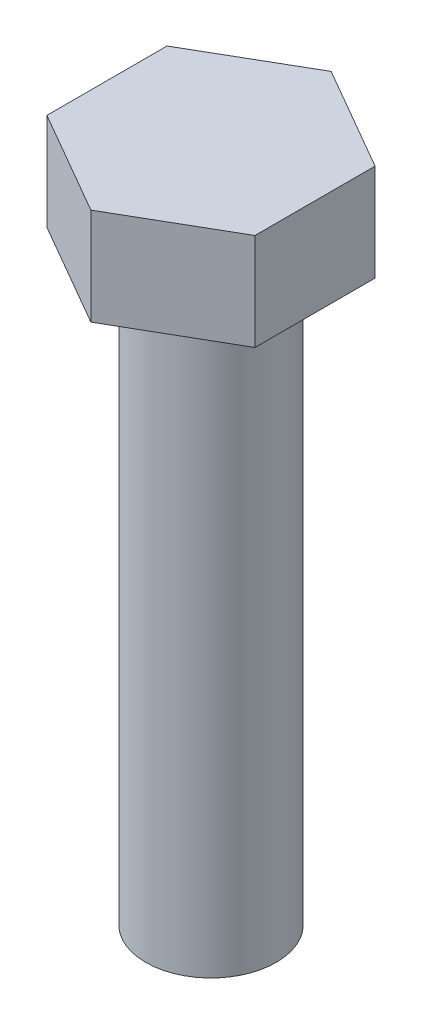
ISO-10303-21;
HEADER;
FILE_DESCRIPTION(('STEP AP214'),'2;1');
FILE_NAME('part.step','',(''),(''),'','','');
FILE_SCHEMA(('AUTOMOTIVE_DESIGN { 1 0 10303 214 1 1 1 1 }'));
ENDSEC;
DATA;
#1=APPLICATION_CONTEXT('core data for automotive mechanical design processes');
#2=APPLICATION_PROTOCOL_DEFINITION('international standard','automotive_design',2000,#1);
#3=PRODUCT_CONTEXT('',#1,'mechanical');
#4=PRODUCT('Part','Part','',(#3));
#5=PRODUCT_RELATED_PRODUCT_CATEGORY('part','',(#4));
#6=PRODUCT_DEFINITION_FORMATION('','',#4);
#7=PRODUCT_DEFINITION_CONTEXT('part definition',#1,'design');
#8=PRODUCT_DEFINITION('design','',#6,#7);
#9=PRODUCT_DEFINITION_SHAPE('','',#8);
#10=(LENGTH_UNIT() NAMED_UNIT(*) SI_UNIT(.MILLI.,.METRE.));
#11=(NAMED_UNIT(*) PLANE_ANGLE_UNIT() SI_UNIT($,.RADIAN.));
#12=(NAMED_UNIT(*) SI_UNIT($,.STERADIAN.) SOLID_ANGLE_UNIT());
#13=UNCERTAINTY_MEASURE_WITH_UNIT(LENGTH_MEASURE(1.E-05),#10,'distance_accuracy_value','');
#14=(GEOMETRIC_REPRESENTATION_CONTEXT(3) GLOBAL_UNCERTAINTY_ASSIGNED_CONTEXT((#13)) GLOBAL_UNIT_ASSIGNED_CONTEXT((#10,
#11,#12)) REPRESENTATION_CONTEXT('',''));
#15=CARTESIAN_POINT('',(0.,0.,0.));
#16=DIRECTION('',(0.,0.,1.));
#17=DIRECTION('',(1.,0.,0.));
#18=AXIS2_PLACEMENT_3D('',#15,#16,#17);
#19=CARTESIAN_POINT('',(5.44829999999996,5.08,-3.1455774716259));
#20=DIRECTION('',(-0.499999999999995,0.,0.866025403784442));
#21=DIRECTION('',(0.866025403784442,0.,0.499999999999995));
#22=AXIS2_PLACEMENT_3D('',#19,#20,#21);
#23=PLANE('',#22);
#24=DIRECTION('',(-0.866025403784441,0.,-0.499999999999995));
#25=VECTOR('',#24,1.);
#26=CARTESIAN_POINT('',(5.44829999999996,0.,-3.1455774716259));
#27=LINE('',#26,#25);
#28=CARTESIAN_POINT('',(5.44829999999996,0.,-3.1455774716259));
#29=VERTEX_POINT('',#28);
#30=CARTESIAN_POINT('',(0.,0.,-6.29115494325167));
#31=VERTEX_POINT('',#30);
#32=EDGE_CURVE('E136',#29,#31,#27,.T.);
#33=ORIENTED_EDGE('',*,*,#32,.T.);
#34=DIRECTION('',(0.,-1.,0.));
#35=VECTOR('',#34,1.);
#36=CARTESIAN_POINT('',(0.,5.08,-6.29115494325167));
#37=LINE('',#36,#35);
#38=CARTESIAN_POINT('',(0.,5.08,-6.29115494325167));
#39=VERTEX_POINT('',#38);
#40=EDGE_CURVE('E48',#39,#31,#37,.T.);
#41=ORIENTED_EDGE('',*,*,#40,.F.);
#42=DIRECTION('',(-0.866025403784441,0.,-0.499999999999995));
#43=VECTOR('',#42,1.);
#44=CARTESIAN_POINT('',(5.44829999999996,5.08,-3.1455774716259));
#45=LINE('',#44,#43);
#46=CARTESIAN_POINT('',(5.44829999999996,5.08,-3.1455774716259));
#47=VERTEX_POINT('',#46);
#48=EDGE_CURVE('E153',#47,#39,#45,.T.);
#49=ORIENTED_EDGE('',*,*,#48,.F.);
#50=DIRECTION('',(0.,-1.,0.));
#51=VECTOR('',#50,1.);
#52=CARTESIAN_POINT('',(5.44829999999996,5.08,-3.1455774716259));
#53=LINE('',#52,#51);
#54=EDGE_CURVE('E135',#47,#29,#53,.T.);
#55=ORIENTED_EDGE('',*,*,#54,.T.);
#56=EDGE_LOOP('',(#33,#41,#49,#55));
#57=FACE_BOUND('',#56,.T.);
#58=ADVANCED_FACE('F44',(#57),#23,.F.);
#59=CARTESIAN_POINT('',(0.,5.08,-6.29115494325167));
#60=DIRECTION('',(0.500000000000001,0.,0.866025403784438));
#61=DIRECTION('',(0.866025403784438,0.,-0.500000000000001));
#62=AXIS2_PLACEMENT_3D('',#59,#60,#61);
#63=PLANE('',#62);
#64=DIRECTION('',(-0.866025403784438,0.,0.500000000000001));
#65=VECTOR('',#64,1.);
#66=CARTESIAN_POINT('',(0.,0.,-6.29115494325167));
#67=LINE('',#66,#65);
#68=CARTESIAN_POINT('',(-5.4483,0.,-3.14557747162582));
#69=VERTEX_POINT('',#68);
#70=EDGE_CURVE('E139',#31,#69,#67,.T.);
#71=ORIENTED_EDGE('',*,*,#70,.T.);
#72=DIRECTION('',(0.,-1.,0.));
#73=VECTOR('',#72,1.);
#74=CARTESIAN_POINT('',(-5.4483,5.08,-3.14557747162582));
#75=LINE('',#74,#73);
#76=CARTESIAN_POINT('',(-5.4483,5.08,-3.14557747162582));
#77=VERTEX_POINT('',#76);
#78=EDGE_CURVE('E159',#77,#69,#75,.T.);
#79=ORIENTED_EDGE('',*,*,#78,.F.);
#80=DIRECTION('',(-0.866025403784438,0.,0.500000000000001));
#81=VECTOR('',#80,1.);
#82=CARTESIAN_POINT('',(0.,5.08,-6.29115494325167));
#83=LINE('',#82,#81);
#84=EDGE_CURVE('E102',#39,#77,#83,.T.);
#85=ORIENTED_EDGE('',*,*,#84,.F.);
#86=ORIENTED_EDGE('',*,*,#40,.T.);
#87=EDGE_LOOP('',(#71,#79,#85,#86));
#88=FACE_BOUND('',#87,.T.);
#89=ADVANCED_FACE('F168',(#88),#63,.F.);
#90=CARTESIAN_POINT('',(-5.4483,5.08,-3.14557747162582));
#91=DIRECTION('',(1.,0.,0.));
#92=DIRECTION('',(0.,0.,-1.));
#93=AXIS2_PLACEMENT_3D('',#90,#91,#92);
#94=PLANE('',#93);
#95=DIRECTION('',(0.,0.,1.));
#96=VECTOR('',#95,1.);
#97=CARTESIAN_POINT('',(-5.4483,0.,-3.14557747162582));
#98=LINE('',#97,#96);
#99=CARTESIAN_POINT('',(-5.44829999999998,0.,3.14557747162586));
#100=VERTEX_POINT('',#99);
#101=EDGE_CURVE('E143',#69,#100,#98,.T.);
#102=ORIENTED_EDGE('',*,*,#101,.T.);
#103=DIRECTION('',(0.,-1.,0.));
#104=VECTOR('',#103,1.);
#105=CARTESIAN_POINT('',(-5.44829999999998,5.08,3.14557747162586));
#106=LINE('',#105,#104);
#107=CARTESIAN_POINT('',(-5.44829999999998,5.08,3.14557747162586));
#108=VERTEX_POINT('',#107);
#109=EDGE_CURVE('E124',#108,#100,#106,.T.);
#110=ORIENTED_EDGE('',*,*,#109,.F.);
#111=DIRECTION('',(0.,0.,1.));
#112=VECTOR('',#111,1.);
#113=CARTESIAN_POINT('',(-5.4483,5.08,-3.14557747162582));
#114=LINE('',#113,#112);
#115=EDGE_CURVE('E114',#77,#108,#114,.T.);
#116=ORIENTED_EDGE('',*,*,#115,.F.);
#117=ORIENTED_EDGE('',*,*,#78,.T.);
#118=EDGE_LOOP('',(#102,#110,#116,#117));
#119=FACE_BOUND('',#118,.T.);
#120=ADVANCED_FACE('F175',(#119),#94,.F.);
#121=CARTESIAN_POINT('',(-5.44829999999998,5.08,3.14557747162586));
#122=DIRECTION('',(0.499999999999995,0.,-0.866025403784441));
#123=DIRECTION('',(-0.866025403784442,0.,-0.499999999999995));
#124=AXIS2_PLACEMENT_3D('',#121,#122,#123);
#125=PLANE('',#124);
#126=DIRECTION('',(0.866025403784442,0.,0.499999999999995));
#127=VECTOR('',#126,1.);
#128=CARTESIAN_POINT('',(-5.44829999999998,0.,3.14557747162586));
#129=LINE('',#128,#127);
#130=CARTESIAN_POINT('',(0.,0.,6.29115494325167));
#131=VERTEX_POINT('',#130);
#132=EDGE_CURVE('E121',#100,#131,#129,.T.);
#133=ORIENTED_EDGE('',*,*,#132,.T.);
#134=DIRECTION('',(0.,-1.,0.));
#135=VECTOR('',#134,1.);
#136=CARTESIAN_POINT('',(0.,5.08,6.29115494325167));
#137=LINE('',#136,#135);
#138=CARTESIAN_POINT('',(0.,5.08,6.29115494325167));
#139=VERTEX_POINT('',#138);
#140=EDGE_CURVE('E116',#139,#131,#137,.T.);
#141=ORIENTED_EDGE('',*,*,#140,.F.);
#142=DIRECTION('',(0.866025403784442,0.,0.499999999999995));
#143=VECTOR('',#142,1.);
#144=CARTESIAN_POINT('',(-5.44829999999998,5.08,3.14557747162586));
#145=LINE('',#144,#143);
#146=EDGE_CURVE('E108',#108,#139,#145,.T.);
#147=ORIENTED_EDGE('',*,*,#146,.F.);
#148=ORIENTED_EDGE('',*,*,#109,.T.);
#149=EDGE_LOOP('',(#133,#141,#147,#148));
#150=FACE_BOUND('',#149,.T.);
#151=ADVANCED_FACE('F123',(#150),#125,.F.);
#152=CARTESIAN_POINT('',(0.,5.08,6.29115494325167));
#153=DIRECTION('',(-0.500000000000007,0.,-0.866025403784435));
#154=DIRECTION('',(-0.866025403784435,0.,0.500000000000007));
#155=AXIS2_PLACEMENT_3D('',#152,#153,#154);
#156=PLANE('',#155);
#157=DIRECTION('',(0.866025403784435,0.,-0.500000000000007));
#158=VECTOR('',#157,1.);
#159=CARTESIAN_POINT('',(0.,0.,6.29115494325167));
#160=LINE('',#159,#158);
#161=CARTESIAN_POINT('',(5.44830000000002,0.,3.14557747162578));
#162=VERTEX_POINT('',#161);
#163=EDGE_CURVE('E86',#131,#162,#160,.T.);
#164=ORIENTED_EDGE('',*,*,#163,.T.);
#165=DIRECTION('',(0.,-1.,0.));
#166=VECTOR('',#165,1.);
#167=CARTESIAN_POINT('',(5.44830000000002,5.08,3.14557747162578));
#168=LINE('',#167,#166);
#169=CARTESIAN_POINT('',(5.44830000000002,5.08,3.14557747162578));
#170=VERTEX_POINT('',#169);
#171=EDGE_CURVE('E128',#170,#162,#168,.T.);
#172=ORIENTED_EDGE('',*,*,#171,.F.);
#173=DIRECTION('',(0.866025403784435,0.,-0.500000000000007));
#174=VECTOR('',#173,1.);
#175=CARTESIAN_POINT('',(0.,5.08,6.29115494325167));
#176=LINE('',#175,#174);
#177=EDGE_CURVE('E115',#139,#170,#176,.T.);
#178=ORIENTED_EDGE('',*,*,#177,.F.);
#179=ORIENTED_EDGE('',*,*,#140,.T.);
#180=EDGE_LOOP('',(#164,#172,#178,#179));
#181=FACE_BOUND('',#180,.T.);
#182=ADVANCED_FACE('F126',(#181),#156,.F.);
#183=CARTESIAN_POINT('',(5.44830000000002,5.08,3.14557747162578));
#184=DIRECTION('',(-1.,0.,0.));
#185=DIRECTION('',(0.,0.,1.));
#186=AXIS2_PLACEMENT_3D('',#183,#184,#185);
#187=PLANE('',#186);
#188=DIRECTION('',(0.,0.,-1.));
#189=VECTOR('',#188,1.);
#190=CARTESIAN_POINT('',(5.44830000000002,0.,3.14557747162578));
#191=LINE('',#190,#189);
#192=EDGE_CURVE('E95',#162,#29,#191,.T.);
#193=ORIENTED_EDGE('',*,*,#192,.T.);
#194=ORIENTED_EDGE('',*,*,#54,.F.);
#195=DIRECTION('',(0.,0.,-1.));
#196=VECTOR('',#195,1.);
#197=CARTESIAN_POINT('',(5.44830000000002,5.08,3.14557747162578));
#198=LINE('',#197,#196);
#199=EDGE_CURVE('E63',#170,#47,#198,.T.);
#200=ORIENTED_EDGE('',*,*,#199,.F.);
#201=ORIENTED_EDGE('',*,*,#171,.T.);
#202=EDGE_LOOP('',(#193,#194,#200,#201));
#203=FACE_BOUND('',#202,.T.);
#204=ADVANCED_FACE('F197',(#203),#187,.F.);
#205=CARTESIAN_POINT('',(0.,5.08,0.));
#206=DIRECTION('',(0.,1.,0.));
#207=DIRECTION('',(0.,0.,1.));
#208=AXIS2_PLACEMENT_3D('',#205,#206,#207);
#209=PLANE('',#208);
#210=ORIENTED_EDGE('',*,*,#48,.T.);
#211=ORIENTED_EDGE('',*,*,#84,.T.);
#212=ORIENTED_EDGE('',*,*,#115,.T.);
#213=ORIENTED_EDGE('',*,*,#146,.T.);
#214=ORIENTED_EDGE('',*,*,#177,.T.);
#215=ORIENTED_EDGE('',*,*,#199,.T.);
#216=EDGE_LOOP('',(#210,#211,#212,#213,#214,#215));
#217=FACE_BOUND('',#216,.T.);
#218=ADVANCED_FACE('F106',(#217),#209,.T.);
#219=CARTESIAN_POINT('',(0.,0.,0.));
#220=DIRECTION('',(0.,1.,0.));
#221=DIRECTION('',(0.,0.,1.));
#222=AXIS2_PLACEMENT_3D('',#219,#220,#221);
#223=PLANE('',#222);
#224=CARTESIAN_POINT('',(0.,0.,0.));
#225=DIRECTION('',(0.,-1.,0.));
#226=DIRECTION('',(0.,0.,-1.));
#227=AXIS2_PLACEMENT_3D('',#224,#225,#226);
#228=CIRCLE('',#227,3.4163);
#229=CARTESIAN_POINT('',(0.,0.,3.4163));
#230=VERTEX_POINT('',#229);
#231=EDGE_CURVE('E11',#230,#230,#228,.T.);
#232=ORIENTED_EDGE('',*,*,#231,.F.);
#233=EDGE_LOOP('',(#232));
#234=FACE_BOUND('',#233,.T.);
#235=ORIENTED_EDGE('',*,*,#32,.F.);
#236=ORIENTED_EDGE('',*,*,#192,.F.);
#237=ORIENTED_EDGE('',*,*,#163,.F.);
#238=ORIENTED_EDGE('',*,*,#132,.F.);
#239=ORIENTED_EDGE('',*,*,#101,.F.);
#240=ORIENTED_EDGE('',*,*,#70,.F.);
#241=EDGE_LOOP('',(#235,#236,#237,#238,#239,#240));
#242=FACE_BOUND('',#241,.T.);
#243=ADVANCED_FACE('F173',(#234,#242),#223,.F.);
#244=CARTESIAN_POINT('',(0.,-30.48,0.));
#245=DIRECTION('',(0.,1.,0.));
#246=DIRECTION('',(0.,0.,1.));
#247=AXIS2_PLACEMENT_3D('',#244,#245,#246);
#248=CYLINDRICAL_SURFACE('',#247,3.4163);
#249=CARTESIAN_POINT('',(0.,-30.48,0.));
#250=DIRECTION('',(0.,-1.,0.));
#251=DIRECTION('',(0.,0.,-1.));
#252=AXIS2_PLACEMENT_3D('',#249,#250,#251);
#253=CIRCLE('',#252,3.4163);
#254=CARTESIAN_POINT('',(0.,-30.48,3.4163));
#255=VERTEX_POINT('',#254);
#256=EDGE_CURVE('E141',#255,#255,#253,.T.);
#257=CARTESIAN_POINT('',(0.,-30.48,3.4163));
#258=CARTESIAN_POINT('',(0.,-30.1625,3.4163));
#259=CARTESIAN_POINT('',(0.,-29.845,3.4163));
#260=CARTESIAN_POINT('',(0.,-29.21,3.4163));
#261=CARTESIAN_POINT('',(0.,-28.8925,3.4163));
#262=CARTESIAN_POINT('',(0.,-28.2575,3.4163));
#263=CARTESIAN_POINT('',(0.,-27.94,3.4163));
#264=CARTESIAN_POINT('',(0.,-27.305,3.4163));
#265=CARTESIAN_POINT('',(0.,-26.9875,3.4163));
#266=CARTESIAN_POINT('',(0.,-26.3525,3.4163));
#267=CARTESIAN_POINT('',(0.,-26.035,3.4163));
#268=CARTESIAN_POINT('',(0.,-25.4,3.4163));
#269=CARTESIAN_POINT('',(0.,-25.0825,3.4163));
#270=CARTESIAN_POINT('',(0.,-24.4475,3.4163));
#271=CARTESIAN_POINT('',(0.,-24.13,3.4163));
#272=CARTESIAN_POINT('',(0.,-23.495,3.4163));
#273=CARTESIAN_POINT('',(0.,-23.1775,3.4163));
#274=CARTESIAN_POINT('',(0.,-22.5425,3.4163));
#275=CARTESIAN_POINT('',(0.,-22.225,3.4163));
#276=CARTESIAN_POINT('',(0.,-21.59,3.4163));
#277=CARTESIAN_POINT('',(0.,-21.2725,3.4163));
#278=CARTESIAN_POINT('',(0.,-20.6375,3.4163));
#279=CARTESIAN_POINT('',(0.,-20.32,3.4163));
#280=CARTESIAN_POINT('',(0.,-19.685,3.4163));
#281=CARTESIAN_POINT('',(0.,-19.3675,3.4163));
#282=CARTESIAN_POINT('',(0.,-18.7325,3.4163));
#283=CARTESIAN_POINT('',(0.,-18.415,3.4163));
#284=CARTESIAN_POINT('',(0.,-17.78,3.4163));
#285=CARTESIAN_POINT('',(0.,-17.4625,3.4163));
#286=CARTESIAN_POINT('',(0.,-16.8275,3.4163));
#287=CARTESIAN_POINT('',(0.,-16.51,3.4163));
#288=CARTESIAN_POINT('',(0.,-15.875,3.4163));
#289=CARTESIAN_POINT('',(0.,-15.5575,3.4163));
#290=CARTESIAN_POINT('',(0.,-14.9225,3.4163));
#291=CARTESIAN_POINT('',(0.,-14.605,3.4163));
#292=CARTESIAN_POINT('',(0.,-13.97,3.4163));
#293=CARTESIAN_POINT('',(0.,-13.6525,3.4163));
#294=CARTESIAN_POINT('',(0.,-13.0175,3.4163));
#295=CARTESIAN_POINT('',(0.,-12.7,3.4163));
#296=CARTESIAN_POINT('',(0.,-12.065,3.4163));
#297=CARTESIAN_POINT('',(0.,-11.7475,3.4163));
#298=CARTESIAN_POINT('',(0.,-11.1125,3.4163));
#299=CARTESIAN_POINT('',(0.,-10.795,3.4163));
#300=CARTESIAN_POINT('',(0.,-10.16,3.4163));
#301=CARTESIAN_POINT('',(0.,-9.8425,3.4163));
#302=CARTESIAN_POINT('',(0.,-9.2075,3.4163));
#303=CARTESIAN_POINT('',(0.,-8.89,3.4163));
#304=CARTESIAN_POINT('',(0.,-8.255,3.4163));
#305=CARTESIAN_POINT('',(0.,-7.9375,3.4163));
#306=CARTESIAN_POINT('',(0.,-7.3025,3.4163));
#307=CARTESIAN_POINT('',(0.,-6.985,3.4163));
#308=CARTESIAN_POINT('',(0.,-6.35,3.4163));
#309=CARTESIAN_POINT('',(0.,-6.0325,3.4163));
#310=CARTESIAN_POINT('',(0.,-5.3975,3.4163));
#311=CARTESIAN_POINT('',(0.,-5.08,3.4163));
#312=CARTESIAN_POINT('',(0.,-4.445,3.4163));
#313=CARTESIAN_POINT('',(0.,-4.1275,3.4163));
#314=CARTESIAN_POINT('',(0.,-3.4925,3.4163));
#315=CARTESIAN_POINT('',(0.,-3.175,3.4163));
#316=CARTESIAN_POINT('',(0.,-2.54,3.4163));
#317=CARTESIAN_POINT('',(0.,-2.2225,3.4163));
#318=CARTESIAN_POINT('',(0.,-1.5875,3.4163));
#319=CARTESIAN_POINT('',(0.,-1.27,3.4163));
#320=CARTESIAN_POINT('',(0.,-0.634999999999999,3.4163));
#321=CARTESIAN_POINT('',(0.,-0.3175,3.4163));
#322=CARTESIAN_POINT('',(0.,0.,3.4163));
#323=B_SPLINE_CURVE_WITH_KNOTS('',3,(#257,#258,#259,#260,#261,#262,#263,#264,#265,#266,#267,
#268,#269,#270,#271,#272,#273,#274,#275,#276,#277,#278,#279,#280,#281,#282,#283,#284,#285,#286,
#287,#288,#289,#290,#291,#292,#293,#294,#295,#296,#297,#298,#299,#300,#301,#302,#303,#304,#305,
#306,#307,#308,#309,#310,#311,#312,#313,#314,#315,#316,#317,#318,#319,#320,#321,#322),
.UNSPECIFIED.,.F.,.F.,(4,2,2,2,2,2,2,2,2,2,2,2,2,2,2,2,2,2,2,2,2,2,2,2,2,2,2,2,2,2,2,2,4),(0.,
0.952500000000002,1.905,2.8575,3.81,4.7625,5.715,6.6675,7.62,8.5725,9.525,10.4775,11.43,12.3825,
13.335,14.2875,15.24,16.1925,17.145,18.0975,19.05,20.0025,20.955,21.9075,22.86,23.8125,24.765,
25.7175,26.67,27.6225,28.575,29.5275,30.48),.UNSPECIFIED.);
#324=EDGE_CURVE('BSEAM184',#255,#230,#323,.T.);
#325=ORIENTED_EDGE('',*,*,#256,.F.);
#326=ORIENTED_EDGE('',*,*,#231,.T.);
#327=ORIENTED_EDGE('',*,*,#324,.T.);
#328=ORIENTED_EDGE('',*,*,#324,.F.);
#329=EDGE_LOOP('',(#325,#327,#326,#328));
#330=FACE_BOUND('',#329,.T.);
#331=ADVANCED_FACE('F184',(#330),#248,.T.);
#332=CARTESIAN_POINT('',(0.,-30.48,0.));
#333=DIRECTION('',(0.,-1.,0.));
#334=DIRECTION('',(0.,0.,-1.));
#335=AXIS2_PLACEMENT_3D('',#332,#333,#334);
#336=PLANE('',#335);
#337=ORIENTED_EDGE('',*,*,#256,.T.);
#338=EDGE_LOOP('',(#337));
#339=FACE_BOUND('',#338,.T.);
#340=ADVANCED_FACE('F183',(#339),#336,.T.);
#341=CLOSED_SHELL('',(#58,#89,#120,#151,#182,#204,#218,#243,#331,#340));
#342=MANIFOLD_SOLID_BREP('B2',#341);
#343=ADVANCED_BREP_SHAPE_REPRESENTATION('',(#18,#342),#14);
#344=SHAPE_DEFINITION_REPRESENTATION(#9,#343);
ENDSEC;
END-ISO-10303-21;
